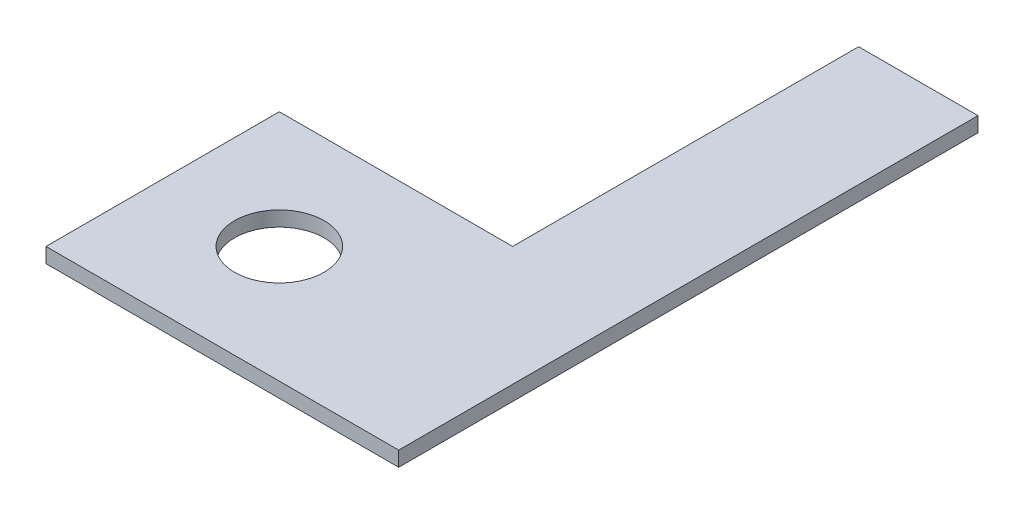
ISO-10303-21;
HEADER;
FILE_DESCRIPTION(('STEP AP214'),'2;1');
FILE_NAME('part.step','',(''),(''),'','','');
FILE_SCHEMA(('AUTOMOTIVE_DESIGN { 1 0 10303 214 1 1 1 1 }'));
ENDSEC;
DATA;
#1=APPLICATION_CONTEXT('core data for automotive mechanical design processes');
#2=APPLICATION_PROTOCOL_DEFINITION('international standard','automotive_design',2000,#1);
#3=PRODUCT_CONTEXT('',#1,'mechanical');
#4=PRODUCT('Part','Part','',(#3));
#5=PRODUCT_RELATED_PRODUCT_CATEGORY('part','',(#4));
#6=PRODUCT_DEFINITION_FORMATION('','',#4);
#7=PRODUCT_DEFINITION_CONTEXT('part definition',#1,'design');
#8=PRODUCT_DEFINITION('design','',#6,#7);
#9=PRODUCT_DEFINITION_SHAPE('','',#8);
#10=(LENGTH_UNIT() NAMED_UNIT(*) SI_UNIT(.MILLI.,.METRE.));
#11=(NAMED_UNIT(*) PLANE_ANGLE_UNIT() SI_UNIT($,.RADIAN.));
#12=(NAMED_UNIT(*) SI_UNIT($,.STERADIAN.) SOLID_ANGLE_UNIT());
#13=UNCERTAINTY_MEASURE_WITH_UNIT(LENGTH_MEASURE(1.E-05),#10,'distance_accuracy_value','');
#14=(GEOMETRIC_REPRESENTATION_CONTEXT(3) GLOBAL_UNCERTAINTY_ASSIGNED_CONTEXT((#13)) GLOBAL_UNIT_ASSIGNED_CONTEXT((#10,
#11,#12)) REPRESENTATION_CONTEXT('',''));
#15=CARTESIAN_POINT('',(0.,0.,0.));
#16=DIRECTION('',(0.,0.,1.));
#17=DIRECTION('',(1.,0.,0.));
#18=AXIS2_PLACEMENT_3D('',#15,#16,#17);
#19=CARTESIAN_POINT('',(31.635,2.,-31.635));
#20=DIRECTION('',(-1.,0.,0.));
#21=DIRECTION('',(0.,0.,1.));
#22=AXIS2_PLACEMENT_3D('',#19,#20,#21);
#23=PLANE('',#22);
#24=DIRECTION('',(0.,0.,-1.));
#25=VECTOR('',#24,1.);
#26=CARTESIAN_POINT('',(31.635,2.,-31.635));
#27=LINE('',#26,#25);
#28=CARTESIAN_POINT('',(31.635,2.,15.635));
#29=VERTEX_POINT('',#28);
#30=CARTESIAN_POINT('',(31.635,2.,-62.));
#31=VERTEX_POINT('',#30);
#32=EDGE_CURVE('E164',#29,#31,#27,.T.);
#33=ORIENTED_EDGE('',*,*,#32,.F.);
#34=DIRECTION('',(0.,-1.,0.));
#35=VECTOR('',#34,1.);
#36=CARTESIAN_POINT('',(31.635,10.,15.635));
#37=LINE('',#36,#35);
#38=CARTESIAN_POINT('',(31.635,0.,15.635));
#39=VERTEX_POINT('',#38);
#40=EDGE_CURVE('E129',#29,#39,#37,.T.);
#41=ORIENTED_EDGE('',*,*,#40,.T.);
#42=DIRECTION('',(0.,0.,-1.));
#43=VECTOR('',#42,1.);
#44=CARTESIAN_POINT('',(31.635,0.,-31.635));
#45=LINE('',#44,#43);
#46=CARTESIAN_POINT('',(31.635,0.,-62.));
#47=VERTEX_POINT('',#46);
#48=EDGE_CURVE('E160',#39,#47,#45,.T.);
#49=ORIENTED_EDGE('',*,*,#48,.T.);
#50=DIRECTION('',(0.,1.,0.));
#51=VECTOR('',#50,1.);
#52=CARTESIAN_POINT('',(31.635,0.,-62.));
#53=LINE('',#52,#51);
#54=EDGE_CURVE('E144',#47,#31,#53,.T.);
#55=ORIENTED_EDGE('',*,*,#54,.T.);
#56=EDGE_LOOP('',(#33,#41,#49,#55));
#57=FACE_BOUND('',#56,.T.);
#58=ADVANCED_FACE('F45',(#57),#23,.F.);
#59=CARTESIAN_POINT('',(0.,2.,0.));
#60=DIRECTION('',(0.,1.,0.));
#61=DIRECTION('',(0.,0.,1.));
#62=AXIS2_PLACEMENT_3D('',#59,#60,#61);
#63=PLANE('',#62);
#64=DIRECTION('',(1.,0.,0.));
#65=VECTOR('',#64,1.);
#66=CARTESIAN_POINT('',(0.,2.,-15.635));
#67=LINE('',#66,#65);
#68=CARTESIAN_POINT('',(-15.635,2.,-15.635));
#69=VERTEX_POINT('',#68);
#70=CARTESIAN_POINT('',(15.635,2.,-15.635));
#71=VERTEX_POINT('',#70);
#72=EDGE_CURVE('E114',#69,#71,#67,.T.);
#73=ORIENTED_EDGE('',*,*,#72,.F.);
#74=DIRECTION('',(0.,0.,-1.));
#75=VECTOR('',#74,1.);
#76=CARTESIAN_POINT('',(-15.635,2.,0.));
#77=LINE('',#76,#75);
#78=CARTESIAN_POINT('',(-15.635,2.,15.635));
#79=VERTEX_POINT('',#78);
#80=EDGE_CURVE('E137',#79,#69,#77,.T.);
#81=ORIENTED_EDGE('',*,*,#80,.F.);
#82=DIRECTION('',(-1.,0.,0.));
#83=VECTOR('',#82,1.);
#84=CARTESIAN_POINT('',(0.,2.,15.635));
#85=LINE('',#84,#83);
#86=EDGE_CURVE('E67',#29,#79,#85,.T.);
#87=ORIENTED_EDGE('',*,*,#86,.F.);
#88=ORIENTED_EDGE('',*,*,#32,.T.);
#89=DIRECTION('',(-1.,0.,0.));
#90=VECTOR('',#89,1.);
#91=CARTESIAN_POINT('',(15.635,2.,-62.));
#92=LINE('',#91,#90);
#93=CARTESIAN_POINT('',(15.635,2.,-62.));
#94=VERTEX_POINT('',#93);
#95=EDGE_CURVE('E109',#31,#94,#92,.T.);
#96=ORIENTED_EDGE('',*,*,#95,.T.);
#97=DIRECTION('',(0.,0.,1.));
#98=VECTOR('',#97,1.);
#99=CARTESIAN_POINT('',(15.635,2.,0.));
#100=LINE('',#99,#98);
#101=EDGE_CURVE('E140',#94,#71,#100,.T.);
#102=ORIENTED_EDGE('',*,*,#101,.T.);
#103=EDGE_LOOP('',(#73,#81,#87,#88,#96,#102));
#104=FACE_BOUND('',#103,.T.);
#105=CARTESIAN_POINT('',(0.,2.,0.));
#106=DIRECTION('',(0.,1.,0.));
#107=DIRECTION('',(0.,0.,1.));
#108=AXIS2_PLACEMENT_3D('',#105,#106,#107);
#109=CIRCLE('',#108,6.);
#110=CARTESIAN_POINT('',(0.,2.,6.));
#111=VERTEX_POINT('',#110);
#112=EDGE_CURVE('E152',#111,#111,#109,.T.);
#113=ORIENTED_EDGE('',*,*,#112,.F.);
#114=EDGE_LOOP('',(#113));
#115=FACE_BOUND('',#114,.T.);
#116=ADVANCED_FACE('F173',(#104,#115),#63,.T.);
#117=CARTESIAN_POINT('',(0.,0.,0.));
#118=DIRECTION('',(0.,1.,0.));
#119=DIRECTION('',(0.,0.,1.));
#120=AXIS2_PLACEMENT_3D('',#117,#118,#119);
#121=PLANE('',#120);
#122=CARTESIAN_POINT('',(0.,0.,0.));
#123=DIRECTION('',(0.,1.,0.));
#124=DIRECTION('',(0.,0.,1.));
#125=AXIS2_PLACEMENT_3D('',#122,#123,#124);
#126=CIRCLE('',#125,6.);
#127=CARTESIAN_POINT('',(0.,0.,6.));
#128=VERTEX_POINT('',#127);
#129=EDGE_CURVE('E156',#128,#128,#126,.T.);
#130=ORIENTED_EDGE('',*,*,#129,.T.);
#131=EDGE_LOOP('',(#130));
#132=FACE_BOUND('',#131,.T.);
#133=DIRECTION('',(0.,0.,1.));
#134=VECTOR('',#133,1.);
#135=CARTESIAN_POINT('',(-15.635,0.,-31.635));
#136=LINE('',#135,#134);
#137=CARTESIAN_POINT('',(-15.635,0.,-15.635));
#138=VERTEX_POINT('',#137);
#139=CARTESIAN_POINT('',(-15.635,0.,15.635));
#140=VERTEX_POINT('',#139);
#141=EDGE_CURVE('E120',#138,#140,#136,.T.);
#142=ORIENTED_EDGE('',*,*,#141,.F.);
#143=DIRECTION('',(-1.,0.,0.));
#144=VECTOR('',#143,1.);
#145=CARTESIAN_POINT('',(-15.635,0.,-15.635));
#146=LINE('',#145,#144);
#147=CARTESIAN_POINT('',(15.635,0.,-15.635));
#148=VERTEX_POINT('',#147);
#149=EDGE_CURVE('E60',#148,#138,#146,.T.);
#150=ORIENTED_EDGE('',*,*,#149,.F.);
#151=DIRECTION('',(0.,0.,1.));
#152=VECTOR('',#151,1.);
#153=CARTESIAN_POINT('',(15.635,0.,0.));
#154=LINE('',#153,#152);
#155=CARTESIAN_POINT('',(15.635,0.,-62.));
#156=VERTEX_POINT('',#155);
#157=EDGE_CURVE('E99',#156,#148,#154,.T.);
#158=ORIENTED_EDGE('',*,*,#157,.F.);
#159=DIRECTION('',(-1.,0.,0.));
#160=VECTOR('',#159,1.);
#161=CARTESIAN_POINT('',(15.635,0.,-62.));
#162=LINE('',#161,#160);
#163=EDGE_CURVE('E108',#47,#156,#162,.T.);
#164=ORIENTED_EDGE('',*,*,#163,.F.);
#165=ORIENTED_EDGE('',*,*,#48,.F.);
#166=DIRECTION('',(1.,0.,0.));
#167=VECTOR('',#166,1.);
#168=CARTESIAN_POINT('',(-15.635,0.,15.635));
#169=LINE('',#168,#167);
#170=EDGE_CURVE('E126',#140,#39,#169,.T.);
#171=ORIENTED_EDGE('',*,*,#170,.F.);
#172=EDGE_LOOP('',(#142,#150,#158,#164,#165,#171));
#173=FACE_BOUND('',#172,.T.);
#174=ADVANCED_FACE('F118',(#132,#173),#121,.F.);
#175=CARTESIAN_POINT('',(0.,0.,0.));
#176=DIRECTION('',(0.,1.,0.));
#177=DIRECTION('',(0.,0.,1.));
#178=AXIS2_PLACEMENT_3D('',#175,#176,#177);
#179=CYLINDRICAL_SURFACE('',#178,6.);
#180=ORIENTED_EDGE('',*,*,#129,.F.);
#181=EDGE_LOOP('',(#180));
#182=FACE_BOUND('',#181,.T.);
#183=ORIENTED_EDGE('',*,*,#112,.T.);
#184=EDGE_LOOP('',(#183));
#185=FACE_BOUND('',#184,.T.);
#186=ADVANCED_FACE('F200',(#182,#185),#179,.F.);
#187=CARTESIAN_POINT('',(15.635,0.,0.));
#188=DIRECTION('',(-1.,0.,0.));
#189=DIRECTION('',(0.,0.,1.));
#190=AXIS2_PLACEMENT_3D('',#187,#188,#189);
#191=PLANE('',#190);
#192=ORIENTED_EDGE('',*,*,#157,.T.);
#193=DIRECTION('',(0.,-1.,0.));
#194=VECTOR('',#193,1.);
#195=CARTESIAN_POINT('',(15.635,10.,-15.635));
#196=LINE('',#195,#194);
#197=EDGE_CURVE('E102',#71,#148,#196,.T.);
#198=ORIENTED_EDGE('',*,*,#197,.F.);
#199=ORIENTED_EDGE('',*,*,#101,.F.);
#200=DIRECTION('',(0.,1.,0.));
#201=VECTOR('',#200,1.);
#202=CARTESIAN_POINT('',(15.635,0.,-62.));
#203=LINE('',#202,#201);
#204=EDGE_CURVE('E103',#156,#94,#203,.T.);
#205=ORIENTED_EDGE('',*,*,#204,.F.);
#206=EDGE_LOOP('',(#192,#198,#199,#205));
#207=FACE_BOUND('',#206,.T.);
#208=ADVANCED_FACE('F100',(#207),#191,.T.);
#209=CARTESIAN_POINT('',(15.635,0.,-62.));
#210=DIRECTION('',(0.,0.,-1.));
#211=DIRECTION('',(-1.,0.,0.));
#212=AXIS2_PLACEMENT_3D('',#209,#210,#211);
#213=PLANE('',#212);
#214=ORIENTED_EDGE('',*,*,#95,.F.);
#215=ORIENTED_EDGE('',*,*,#54,.F.);
#216=ORIENTED_EDGE('',*,*,#163,.T.);
#217=ORIENTED_EDGE('',*,*,#204,.T.);
#218=EDGE_LOOP('',(#214,#215,#216,#217));
#219=FACE_BOUND('',#218,.T.);
#220=ADVANCED_FACE('F179',(#219),#213,.T.);
#221=CARTESIAN_POINT('',(-15.635,10.,-31.635));
#222=DIRECTION('',(1.,0.,0.));
#223=DIRECTION('',(0.,0.,-1.));
#224=AXIS2_PLACEMENT_3D('',#221,#222,#223);
#225=PLANE('',#224);
#226=ORIENTED_EDGE('',*,*,#80,.T.);
#227=DIRECTION('',(0.,-1.,0.));
#228=VECTOR('',#227,1.);
#229=CARTESIAN_POINT('',(-15.635,10.,-15.635));
#230=LINE('',#229,#228);
#231=EDGE_CURVE('E11',#69,#138,#230,.T.);
#232=ORIENTED_EDGE('',*,*,#231,.T.);
#233=ORIENTED_EDGE('',*,*,#141,.T.);
#234=DIRECTION('',(0.,1.,0.));
#235=VECTOR('',#234,1.);
#236=CARTESIAN_POINT('',(-15.635,10.,15.635));
#237=LINE('',#236,#235);
#238=EDGE_CURVE('E53',#140,#79,#237,.T.);
#239=ORIENTED_EDGE('',*,*,#238,.T.);
#240=EDGE_LOOP('',(#226,#232,#233,#239));
#241=FACE_BOUND('',#240,.T.);
#242=ADVANCED_FACE('F171',(#241),#225,.F.);
#243=CARTESIAN_POINT('',(-15.635,10.,15.635));
#244=DIRECTION('',(0.,0.,-1.));
#245=DIRECTION('',(-1.,0.,0.));
#246=AXIS2_PLACEMENT_3D('',#243,#244,#245);
#247=PLANE('',#246);
#248=ORIENTED_EDGE('',*,*,#86,.T.);
#249=ORIENTED_EDGE('',*,*,#238,.F.);
#250=ORIENTED_EDGE('',*,*,#170,.T.);
#251=ORIENTED_EDGE('',*,*,#40,.F.);
#252=EDGE_LOOP('',(#248,#249,#250,#251));
#253=FACE_BOUND('',#252,.T.);
#254=ADVANCED_FACE('F182',(#253),#247,.F.);
#255=CARTESIAN_POINT('',(-15.635,10.,-15.635));
#256=DIRECTION('',(0.,0.,1.));
#257=DIRECTION('',(1.,0.,0.));
#258=AXIS2_PLACEMENT_3D('',#255,#256,#257);
#259=PLANE('',#258);
#260=ORIENTED_EDGE('',*,*,#72,.T.);
#261=ORIENTED_EDGE('',*,*,#197,.T.);
#262=ORIENTED_EDGE('',*,*,#149,.T.);
#263=ORIENTED_EDGE('',*,*,#231,.F.);
#264=EDGE_LOOP('',(#260,#261,#262,#263));
#265=FACE_BOUND('',#264,.T.);
#266=ADVANCED_FACE('F112',(#265),#259,.F.);
#267=CLOSED_SHELL('',(#58,#116,#174,#186,#208,#220,#242,#254,#266));
#268=MANIFOLD_SOLID_BREP('B2',#267);
#269=ADVANCED_BREP_SHAPE_REPRESENTATION('',(#18,#268),#14);
#270=SHAPE_DEFINITION_REPRESENTATION(#9,#269);
ENDSEC;
END-ISO-10303-21;
